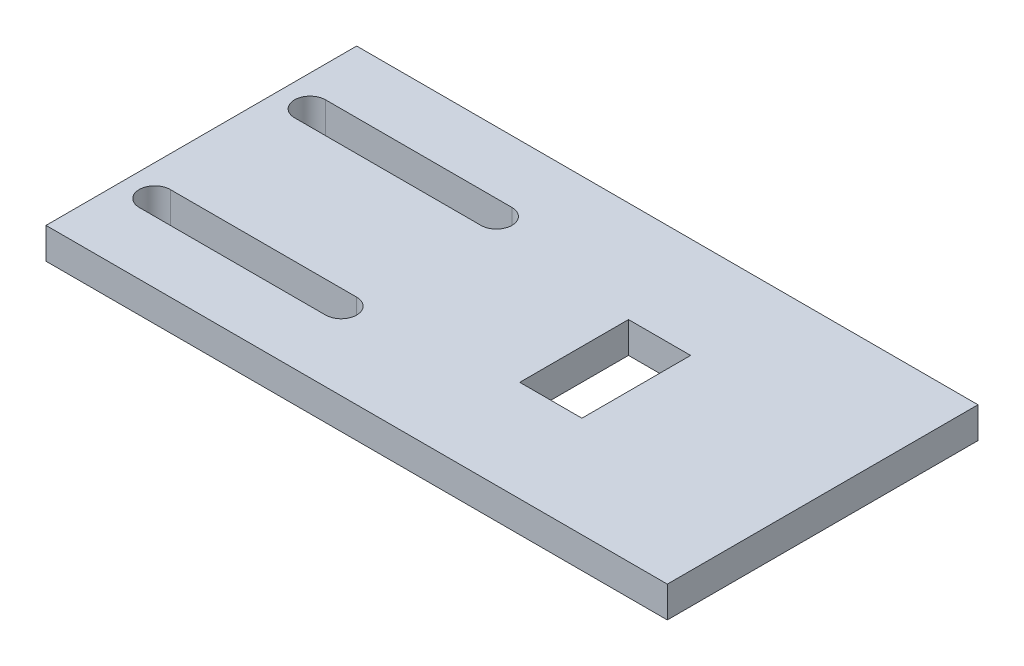
ISO-10303-21;
HEADER;
FILE_DESCRIPTION(('STEP AP214'),'2;1');
FILE_NAME('part.step','',(''),(''),'','','');
FILE_SCHEMA(('AUTOMOTIVE_DESIGN { 1 0 10303 214 1 1 1 1 }'));
ENDSEC;
DATA;
#1=APPLICATION_CONTEXT('core data for automotive mechanical design processes');
#2=APPLICATION_PROTOCOL_DEFINITION('international standard','automotive_design',2000,#1);
#3=PRODUCT_CONTEXT('',#1,'mechanical');
#4=PRODUCT('Part','Part','',(#3));
#5=PRODUCT_RELATED_PRODUCT_CATEGORY('part','',(#4));
#6=PRODUCT_DEFINITION_FORMATION('','',#4);
#7=PRODUCT_DEFINITION_CONTEXT('part definition',#1,'design');
#8=PRODUCT_DEFINITION('design','',#6,#7);
#9=PRODUCT_DEFINITION_SHAPE('','',#8);
#10=(LENGTH_UNIT() NAMED_UNIT(*) SI_UNIT(.MILLI.,.METRE.));
#11=(NAMED_UNIT(*) PLANE_ANGLE_UNIT() SI_UNIT($,.RADIAN.));
#12=(NAMED_UNIT(*) SI_UNIT($,.STERADIAN.) SOLID_ANGLE_UNIT());
#13=UNCERTAINTY_MEASURE_WITH_UNIT(LENGTH_MEASURE(1.E-05),#10,'distance_accuracy_value','');
#14=(GEOMETRIC_REPRESENTATION_CONTEXT(3) GLOBAL_UNCERTAINTY_ASSIGNED_CONTEXT((#13)) GLOBAL_UNIT_ASSIGNED_CONTEXT((#10,
#11,#12)) REPRESENTATION_CONTEXT('',''));
#15=CARTESIAN_POINT('',(0.,0.,0.));
#16=DIRECTION('',(0.,0.,1.));
#17=DIRECTION('',(1.,0.,0.));
#18=AXIS2_PLACEMENT_3D('',#15,#16,#17);
#19=CARTESIAN_POINT('',(50.,5.,-25.));
#20=DIRECTION('',(-1.,0.,0.));
#21=DIRECTION('',(0.,0.,1.));
#22=AXIS2_PLACEMENT_3D('',#19,#20,#21);
#23=PLANE('',#22);
#24=DIRECTION('',(0.,0.,-1.));
#25=VECTOR('',#24,1.);
#26=CARTESIAN_POINT('',(50.,0.,-25.));
#27=LINE('',#26,#25);
#28=CARTESIAN_POINT('',(50.,0.,25.));
#29=VERTEX_POINT('',#28);
#30=CARTESIAN_POINT('',(50.,0.,-25.));
#31=VERTEX_POINT('',#30);
#32=EDGE_CURVE('E243',#29,#31,#27,.T.);
#33=ORIENTED_EDGE('',*,*,#32,.T.);
#34=DIRECTION('',(0.,-1.,0.));
#35=VECTOR('',#34,1.);
#36=CARTESIAN_POINT('',(50.,5.,-25.));
#37=LINE('',#36,#35);
#38=CARTESIAN_POINT('',(50.,5.,-25.));
#39=VERTEX_POINT('',#38);
#40=EDGE_CURVE('E290',#39,#31,#37,.T.);
#41=ORIENTED_EDGE('',*,*,#40,.F.);
#42=DIRECTION('',(0.,0.,-1.));
#43=VECTOR('',#42,1.);
#44=CARTESIAN_POINT('',(50.,5.,-25.));
#45=LINE('',#44,#43);
#46=CARTESIAN_POINT('',(50.,5.,25.));
#47=VERTEX_POINT('',#46);
#48=EDGE_CURVE('E253',#47,#39,#45,.T.);
#49=ORIENTED_EDGE('',*,*,#48,.F.);
#50=DIRECTION('',(0.,-1.,0.));
#51=VECTOR('',#50,1.);
#52=CARTESIAN_POINT('',(50.,5.,25.));
#53=LINE('',#52,#51);
#54=EDGE_CURVE('E267',#47,#29,#53,.T.);
#55=ORIENTED_EDGE('',*,*,#54,.T.);
#56=EDGE_LOOP('',(#33,#41,#49,#55));
#57=FACE_BOUND('',#56,.T.);
#58=ADVANCED_FACE('F45',(#57),#23,.F.);
#59=CARTESIAN_POINT('',(-50.,5.,-25.));
#60=DIRECTION('',(0.,0.,1.));
#61=DIRECTION('',(1.,0.,0.));
#62=AXIS2_PLACEMENT_3D('',#59,#60,#61);
#63=PLANE('',#62);
#64=DIRECTION('',(-1.,0.,0.));
#65=VECTOR('',#64,1.);
#66=CARTESIAN_POINT('',(-50.,0.,-25.));
#67=LINE('',#66,#65);
#68=CARTESIAN_POINT('',(-50.,0.,-25.));
#69=VERTEX_POINT('',#68);
#70=EDGE_CURVE('E271',#31,#69,#67,.T.);
#71=ORIENTED_EDGE('',*,*,#70,.T.);
#72=DIRECTION('',(0.,-1.,0.));
#73=VECTOR('',#72,1.);
#74=CARTESIAN_POINT('',(-50.,5.,-25.));
#75=LINE('',#74,#73);
#76=CARTESIAN_POINT('',(-50.,5.,-25.));
#77=VERTEX_POINT('',#76);
#78=EDGE_CURVE('E286',#77,#69,#75,.T.);
#79=ORIENTED_EDGE('',*,*,#78,.F.);
#80=DIRECTION('',(-1.,0.,0.));
#81=VECTOR('',#80,1.);
#82=CARTESIAN_POINT('',(-50.,5.,-25.));
#83=LINE('',#82,#81);
#84=EDGE_CURVE('E257',#39,#77,#83,.T.);
#85=ORIENTED_EDGE('',*,*,#84,.F.);
#86=ORIENTED_EDGE('',*,*,#40,.T.);
#87=EDGE_LOOP('',(#71,#79,#85,#86));
#88=FACE_BOUND('',#87,.T.);
#89=ADVANCED_FACE('F353',(#88),#63,.F.);
#90=CARTESIAN_POINT('',(-50.,5.,-25.));
#91=DIRECTION('',(1.,0.,0.));
#92=DIRECTION('',(0.,0.,-1.));
#93=AXIS2_PLACEMENT_3D('',#90,#91,#92);
#94=PLANE('',#93);
#95=DIRECTION('',(0.,0.,1.));
#96=VECTOR('',#95,1.);
#97=CARTESIAN_POINT('',(-50.,0.,-25.));
#98=LINE('',#97,#96);
#99=CARTESIAN_POINT('',(-50.,0.,25.));
#100=VERTEX_POINT('',#99);
#101=EDGE_CURVE('E274',#69,#100,#98,.T.);
#102=ORIENTED_EDGE('',*,*,#101,.T.);
#103=DIRECTION('',(0.,-1.,0.));
#104=VECTOR('',#103,1.);
#105=CARTESIAN_POINT('',(-50.,5.,25.));
#106=LINE('',#105,#104);
#107=CARTESIAN_POINT('',(-50.,5.,25.));
#108=VERTEX_POINT('',#107);
#109=EDGE_CURVE('E282',#108,#100,#106,.T.);
#110=ORIENTED_EDGE('',*,*,#109,.F.);
#111=DIRECTION('',(0.,0.,1.));
#112=VECTOR('',#111,1.);
#113=CARTESIAN_POINT('',(-50.,5.,-25.));
#114=LINE('',#113,#112);
#115=EDGE_CURVE('E261',#77,#108,#114,.T.);
#116=ORIENTED_EDGE('',*,*,#115,.F.);
#117=ORIENTED_EDGE('',*,*,#78,.T.);
#118=EDGE_LOOP('',(#102,#110,#116,#117));
#119=FACE_BOUND('',#118,.T.);
#120=ADVANCED_FACE('F358',(#119),#94,.F.);
#121=CARTESIAN_POINT('',(-50.,5.,25.));
#122=DIRECTION('',(0.,0.,-1.));
#123=DIRECTION('',(-1.,0.,0.));
#124=AXIS2_PLACEMENT_3D('',#121,#122,#123);
#125=PLANE('',#124);
#126=DIRECTION('',(1.,0.,0.));
#127=VECTOR('',#126,1.);
#128=CARTESIAN_POINT('',(-50.,0.,25.));
#129=LINE('',#128,#127);
#130=EDGE_CURVE('E258',#100,#29,#129,.T.);
#131=ORIENTED_EDGE('',*,*,#130,.T.);
#132=ORIENTED_EDGE('',*,*,#54,.F.);
#133=DIRECTION('',(1.,0.,0.));
#134=VECTOR('',#133,1.);
#135=CARTESIAN_POINT('',(-50.,5.,25.));
#136=LINE('',#135,#134);
#137=EDGE_CURVE('E264',#108,#47,#136,.T.);
#138=ORIENTED_EDGE('',*,*,#137,.F.);
#139=ORIENTED_EDGE('',*,*,#109,.T.);
#140=EDGE_LOOP('',(#131,#132,#138,#139));
#141=FACE_BOUND('',#140,.T.);
#142=ADVANCED_FACE('F373',(#141),#125,.F.);
#143=CARTESIAN_POINT('',(0.,5.,0.));
#144=DIRECTION('',(0.,1.,0.));
#145=DIRECTION('',(0.,0.,1.));
#146=AXIS2_PLACEMENT_3D('',#143,#144,#145);
#147=PLANE('',#146);
#148=CARTESIAN_POINT('',(-45.,5.,-12.5));
#149=DIRECTION('',(0.,1.,0.));
#150=DIRECTION('',(0.,0.,1.));
#151=AXIS2_PLACEMENT_3D('',#148,#149,#150);
#152=CIRCLE('',#151,2.5);
#153=CARTESIAN_POINT('',(-45.,5.,-15.));
#154=VERTEX_POINT('',#153);
#155=CARTESIAN_POINT('',(-45.,5.,-10.));
#156=VERTEX_POINT('',#155);
#157=EDGE_CURVE('E60',#154,#156,#152,.T.);
#158=ORIENTED_EDGE('',*,*,#157,.F.);
#159=DIRECTION('',(-1.,0.,0.));
#160=VECTOR('',#159,1.);
#161=CARTESIAN_POINT('',(-45.,5.,-15.));
#162=LINE('',#161,#160);
#163=CARTESIAN_POINT('',(-15.,5.,-15.));
#164=VERTEX_POINT('',#163);
#165=EDGE_CURVE('E184',#164,#154,#162,.T.);
#166=ORIENTED_EDGE('',*,*,#165,.F.);
#167=CARTESIAN_POINT('',(-15.,5.,-12.5));
#168=DIRECTION('',(0.,1.,0.));
#169=DIRECTION('',(0.,0.,1.));
#170=AXIS2_PLACEMENT_3D('',#167,#168,#169);
#171=CIRCLE('',#170,2.50000000000001);
#172=CARTESIAN_POINT('',(-15.,5.,-10.));
#173=VERTEX_POINT('',#172);
#174=EDGE_CURVE('E165',#173,#164,#171,.T.);
#175=ORIENTED_EDGE('',*,*,#174,.F.);
#176=DIRECTION('',(1.,0.,0.));
#177=VECTOR('',#176,1.);
#178=CARTESIAN_POINT('',(-45.,5.,-10.));
#179=LINE('',#178,#177);
#180=EDGE_CURVE('E176',#156,#173,#179,.T.);
#181=ORIENTED_EDGE('',*,*,#180,.F.);
#182=EDGE_LOOP('',(#158,#166,#175,#181));
#183=FACE_BOUND('',#182,.T.);
#184=CARTESIAN_POINT('',(-45.,5.,12.5));
#185=DIRECTION('',(0.,1.,0.));
#186=DIRECTION('',(0.,0.,1.));
#187=AXIS2_PLACEMENT_3D('',#184,#185,#186);
#188=CIRCLE('',#187,2.5);
#189=CARTESIAN_POINT('',(-45.,5.,9.99999999999999));
#190=VERTEX_POINT('',#189);
#191=CARTESIAN_POINT('',(-45.,5.,15.));
#192=VERTEX_POINT('',#191);
#193=EDGE_CURVE('E68',#190,#192,#188,.T.);
#194=ORIENTED_EDGE('',*,*,#193,.F.);
#195=DIRECTION('',(-1.,0.,0.));
#196=VECTOR('',#195,1.);
#197=CARTESIAN_POINT('',(-45.,5.,9.99999999999999));
#198=LINE('',#197,#196);
#199=CARTESIAN_POINT('',(-15.,5.,9.99999999999999));
#200=VERTEX_POINT('',#199);
#201=EDGE_CURVE('E202',#200,#190,#198,.T.);
#202=ORIENTED_EDGE('',*,*,#201,.F.);
#203=CARTESIAN_POINT('',(-15.,5.,12.5));
#204=DIRECTION('',(0.,1.,0.));
#205=DIRECTION('',(0.,0.,1.));
#206=AXIS2_PLACEMENT_3D('',#203,#204,#205);
#207=CIRCLE('',#206,2.50000000000001);
#208=CARTESIAN_POINT('',(-15.,5.,15.));
#209=VERTEX_POINT('',#208);
#210=EDGE_CURVE('E215',#209,#200,#207,.T.);
#211=ORIENTED_EDGE('',*,*,#210,.F.);
#212=DIRECTION('',(1.,0.,0.));
#213=VECTOR('',#212,1.);
#214=CARTESIAN_POINT('',(-45.,5.,15.));
#215=LINE('',#214,#213);
#216=EDGE_CURVE('E219',#192,#209,#215,.T.);
#217=ORIENTED_EDGE('',*,*,#216,.F.);
#218=EDGE_LOOP('',(#194,#202,#211,#217));
#219=FACE_BOUND('',#218,.T.);
#220=DIRECTION('',(0.,0.,-1.));
#221=VECTOR('',#220,1.);
#222=CARTESIAN_POINT('',(20.,5.,-8.75));
#223=LINE('',#222,#221);
#224=CARTESIAN_POINT('',(20.,5.,8.75));
#225=VERTEX_POINT('',#224);
#226=CARTESIAN_POINT('',(20.,5.,-8.75));
#227=VERTEX_POINT('',#226);
#228=EDGE_CURVE('E194',#225,#227,#223,.T.);
#229=ORIENTED_EDGE('',*,*,#228,.F.);
#230=DIRECTION('',(1.,0.,0.));
#231=VECTOR('',#230,1.);
#232=CARTESIAN_POINT('',(10.,5.,8.75));
#233=LINE('',#232,#231);
#234=CARTESIAN_POINT('',(10.,5.,8.75));
#235=VERTEX_POINT('',#234);
#236=EDGE_CURVE('E235',#235,#225,#233,.T.);
#237=ORIENTED_EDGE('',*,*,#236,.F.);
#238=DIRECTION('',(0.,0.,1.));
#239=VECTOR('',#238,1.);
#240=CARTESIAN_POINT('',(10.,5.,-8.75));
#241=LINE('',#240,#239);
#242=CARTESIAN_POINT('',(10.,5.,-8.75));
#243=VERTEX_POINT('',#242);
#244=EDGE_CURVE('E231',#243,#235,#241,.T.);
#245=ORIENTED_EDGE('',*,*,#244,.F.);
#246=DIRECTION('',(-1.,0.,0.));
#247=VECTOR('',#246,1.);
#248=CARTESIAN_POINT('',(10.,5.,-8.75));
#249=LINE('',#248,#247);
#250=EDGE_CURVE('E227',#227,#243,#249,.T.);
#251=ORIENTED_EDGE('',*,*,#250,.F.);
#252=EDGE_LOOP('',(#229,#237,#245,#251));
#253=FACE_BOUND('',#252,.T.);
#254=ORIENTED_EDGE('',*,*,#48,.T.);
#255=ORIENTED_EDGE('',*,*,#84,.T.);
#256=ORIENTED_EDGE('',*,*,#115,.T.);
#257=ORIENTED_EDGE('',*,*,#137,.T.);
#258=EDGE_LOOP('',(#254,#255,#256,#257));
#259=FACE_BOUND('',#258,.T.);
#260=ADVANCED_FACE('F181',(#183,#219,#253,#259),#147,.T.);
#261=CARTESIAN_POINT('',(0.,0.,0.));
#262=DIRECTION('',(0.,1.,0.));
#263=DIRECTION('',(0.,0.,1.));
#264=AXIS2_PLACEMENT_3D('',#261,#262,#263);
#265=PLANE('',#264);
#266=DIRECTION('',(-1.,0.,0.));
#267=VECTOR('',#266,1.);
#268=CARTESIAN_POINT('',(0.,0.,-15.));
#269=LINE('',#268,#267);
#270=CARTESIAN_POINT('',(-15.,0.,-15.));
#271=VERTEX_POINT('',#270);
#272=CARTESIAN_POINT('',(-45.,0.,-15.));
#273=VERTEX_POINT('',#272);
#274=EDGE_CURVE('E53',#271,#273,#269,.T.);
#275=ORIENTED_EDGE('',*,*,#274,.T.);
#276=CARTESIAN_POINT('',(-45.,0.,-12.5));
#277=DIRECTION('',(0.,1.,0.));
#278=DIRECTION('',(0.,0.,1.));
#279=AXIS2_PLACEMENT_3D('',#276,#277,#278);
#280=CIRCLE('',#279,2.5);
#281=CARTESIAN_POINT('',(-45.,0.,-10.));
#282=VERTEX_POINT('',#281);
#283=EDGE_CURVE('E11',#273,#282,#280,.T.);
#284=ORIENTED_EDGE('',*,*,#283,.T.);
#285=DIRECTION('',(1.,0.,0.));
#286=VECTOR('',#285,1.);
#287=CARTESIAN_POINT('',(0.,0.,-10.));
#288=LINE('',#287,#286);
#289=CARTESIAN_POINT('',(-15.,0.,-10.));
#290=VERTEX_POINT('',#289);
#291=EDGE_CURVE('E326',#282,#290,#288,.T.);
#292=ORIENTED_EDGE('',*,*,#291,.T.);
#293=CARTESIAN_POINT('',(-15.,0.,-12.5));
#294=DIRECTION('',(0.,1.,0.));
#295=DIRECTION('',(0.,0.,1.));
#296=AXIS2_PLACEMENT_3D('',#293,#294,#295);
#297=CIRCLE('',#296,2.50000000000001);
#298=EDGE_CURVE('E168',#290,#271,#297,.T.);
#299=ORIENTED_EDGE('',*,*,#298,.T.);
#300=EDGE_LOOP('',(#275,#284,#292,#299));
#301=FACE_BOUND('',#300,.T.);
#302=DIRECTION('',(-1.,0.,0.));
#303=VECTOR('',#302,1.);
#304=CARTESIAN_POINT('',(0.,0.,9.99999999999998));
#305=LINE('',#304,#303);
#306=CARTESIAN_POINT('',(-15.,0.,9.99999999999999));
#307=VERTEX_POINT('',#306);
#308=CARTESIAN_POINT('',(-45.,0.,9.99999999999999));
#309=VERTEX_POINT('',#308);
#310=EDGE_CURVE('E318',#307,#309,#305,.T.);
#311=ORIENTED_EDGE('',*,*,#310,.T.);
#312=CARTESIAN_POINT('',(-45.,0.,12.5));
#313=DIRECTION('',(0.,1.,0.));
#314=DIRECTION('',(0.,0.,1.));
#315=AXIS2_PLACEMENT_3D('',#312,#313,#314);
#316=CIRCLE('',#315,2.5);
#317=CARTESIAN_POINT('',(-45.,0.,15.));
#318=VERTEX_POINT('',#317);
#319=EDGE_CURVE('E322',#309,#318,#316,.T.);
#320=ORIENTED_EDGE('',*,*,#319,.T.);
#321=DIRECTION('',(1.,0.,0.));
#322=VECTOR('',#321,1.);
#323=CARTESIAN_POINT('',(0.,0.,15.));
#324=LINE('',#323,#322);
#325=CARTESIAN_POINT('',(-15.,0.,15.));
#326=VERTEX_POINT('',#325);
#327=EDGE_CURVE('E310',#318,#326,#324,.T.);
#328=ORIENTED_EDGE('',*,*,#327,.T.);
#329=CARTESIAN_POINT('',(-15.,0.,12.5));
#330=DIRECTION('',(0.,1.,0.));
#331=DIRECTION('',(0.,0.,1.));
#332=AXIS2_PLACEMENT_3D('',#329,#330,#331);
#333=CIRCLE('',#332,2.50000000000001);
#334=EDGE_CURVE('E314',#326,#307,#333,.T.);
#335=ORIENTED_EDGE('',*,*,#334,.T.);
#336=EDGE_LOOP('',(#311,#320,#328,#335));
#337=FACE_BOUND('',#336,.T.);
#338=DIRECTION('',(1.,0.,0.));
#339=VECTOR('',#338,1.);
#340=CARTESIAN_POINT('',(0.,0.,8.75));
#341=LINE('',#340,#339);
#342=CARTESIAN_POINT('',(10.,0.,8.75));
#343=VERTEX_POINT('',#342);
#344=CARTESIAN_POINT('',(20.,0.,8.75));
#345=VERTEX_POINT('',#344);
#346=EDGE_CURVE('E302',#343,#345,#341,.T.);
#347=ORIENTED_EDGE('',*,*,#346,.T.);
#348=DIRECTION('',(0.,0.,-1.));
#349=VECTOR('',#348,1.);
#350=CARTESIAN_POINT('',(20.,0.,0.));
#351=LINE('',#350,#349);
#352=CARTESIAN_POINT('',(20.,0.,-8.75));
#353=VERTEX_POINT('',#352);
#354=EDGE_CURVE('E306',#345,#353,#351,.T.);
#355=ORIENTED_EDGE('',*,*,#354,.T.);
#356=DIRECTION('',(-1.,0.,0.));
#357=VECTOR('',#356,1.);
#358=CARTESIAN_POINT('',(0.,0.,-8.75));
#359=LINE('',#358,#357);
#360=CARTESIAN_POINT('',(10.,0.,-8.75));
#361=VERTEX_POINT('',#360);
#362=EDGE_CURVE('E294',#353,#361,#359,.T.);
#363=ORIENTED_EDGE('',*,*,#362,.T.);
#364=DIRECTION('',(0.,0.,1.));
#365=VECTOR('',#364,1.);
#366=CARTESIAN_POINT('',(10.,0.,0.));
#367=LINE('',#366,#365);
#368=EDGE_CURVE('E298',#361,#343,#367,.T.);
#369=ORIENTED_EDGE('',*,*,#368,.T.);
#370=EDGE_LOOP('',(#347,#355,#363,#369));
#371=FACE_BOUND('',#370,.T.);
#372=ORIENTED_EDGE('',*,*,#32,.F.);
#373=ORIENTED_EDGE('',*,*,#130,.F.);
#374=ORIENTED_EDGE('',*,*,#101,.F.);
#375=ORIENTED_EDGE('',*,*,#70,.F.);
#376=EDGE_LOOP('',(#372,#373,#374,#375));
#377=FACE_BOUND('',#376,.T.);
#378=ADVANCED_FACE('F333',(#301,#337,#371,#377),#265,.F.);
#379=CARTESIAN_POINT('',(20.,-2.5,-8.75));
#380=DIRECTION('',(1.,0.,0.));
#381=DIRECTION('',(0.,0.,-1.));
#382=AXIS2_PLACEMENT_3D('',#379,#380,#381);
#383=PLANE('',#382);
#384=DIRECTION('',(0.,1.,0.));
#385=VECTOR('',#384,1.);
#386=CARTESIAN_POINT('',(20.,-2.5,8.75));
#387=LINE('',#386,#385);
#388=EDGE_CURVE('E240',#345,#225,#387,.T.);
#389=ORIENTED_EDGE('',*,*,#388,.T.);
#390=ORIENTED_EDGE('',*,*,#228,.T.);
#391=DIRECTION('',(0.,1.,0.));
#392=VECTOR('',#391,1.);
#393=CARTESIAN_POINT('',(20.,-2.5,-8.75));
#394=LINE('',#393,#392);
#395=EDGE_CURVE('E239',#353,#227,#394,.T.);
#396=ORIENTED_EDGE('',*,*,#395,.F.);
#397=ORIENTED_EDGE('',*,*,#354,.F.);
#398=EDGE_LOOP('',(#389,#390,#396,#397));
#399=FACE_BOUND('',#398,.T.);
#400=ADVANCED_FACE('F384',(#399),#383,.F.);
#401=CARTESIAN_POINT('',(10.,-2.5,8.75));
#402=DIRECTION('',(0.,0.,1.));
#403=DIRECTION('',(1.,0.,0.));
#404=AXIS2_PLACEMENT_3D('',#401,#402,#403);
#405=PLANE('',#404);
#406=DIRECTION('',(0.,1.,0.));
#407=VECTOR('',#406,1.);
#408=CARTESIAN_POINT('',(10.,-2.5,8.75));
#409=LINE('',#408,#407);
#410=EDGE_CURVE('E244',#343,#235,#409,.T.);
#411=ORIENTED_EDGE('',*,*,#410,.T.);
#412=ORIENTED_EDGE('',*,*,#236,.T.);
#413=ORIENTED_EDGE('',*,*,#388,.F.);
#414=ORIENTED_EDGE('',*,*,#346,.F.);
#415=EDGE_LOOP('',(#411,#412,#413,#414));
#416=FACE_BOUND('',#415,.T.);
#417=ADVANCED_FACE('F389',(#416),#405,.F.);
#418=CARTESIAN_POINT('',(10.,-2.5,-8.75));
#419=DIRECTION('',(-1.,0.,0.));
#420=DIRECTION('',(0.,0.,1.));
#421=AXIS2_PLACEMENT_3D('',#418,#419,#420);
#422=PLANE('',#421);
#423=DIRECTION('',(0.,1.,0.));
#424=VECTOR('',#423,1.);
#425=CARTESIAN_POINT('',(10.,-2.5,-8.75));
#426=LINE('',#425,#424);
#427=EDGE_CURVE('E247',#361,#243,#426,.T.);
#428=ORIENTED_EDGE('',*,*,#427,.T.);
#429=ORIENTED_EDGE('',*,*,#244,.T.);
#430=ORIENTED_EDGE('',*,*,#410,.F.);
#431=ORIENTED_EDGE('',*,*,#368,.F.);
#432=EDGE_LOOP('',(#428,#429,#430,#431));
#433=FACE_BOUND('',#432,.T.);
#434=ADVANCED_FACE('F395',(#433),#422,.F.);
#435=CARTESIAN_POINT('',(10.,-2.5,-8.75));
#436=DIRECTION('',(0.,0.,-1.));
#437=DIRECTION('',(-1.,0.,0.));
#438=AXIS2_PLACEMENT_3D('',#435,#436,#437);
#439=PLANE('',#438);
#440=ORIENTED_EDGE('',*,*,#395,.T.);
#441=ORIENTED_EDGE('',*,*,#250,.T.);
#442=ORIENTED_EDGE('',*,*,#427,.F.);
#443=ORIENTED_EDGE('',*,*,#362,.F.);
#444=EDGE_LOOP('',(#440,#441,#442,#443));
#445=FACE_BOUND('',#444,.T.);
#446=ADVANCED_FACE('F391',(#445),#439,.F.);
#447=CARTESIAN_POINT('',(-45.,-2.5,12.5));
#448=DIRECTION('',(0.,1.,0.));
#449=DIRECTION('',(0.,0.,1.));
#450=AXIS2_PLACEMENT_3D('',#447,#448,#449);
#451=CYLINDRICAL_SURFACE('',#450,2.5);
#452=DIRECTION('',(0.,1.,0.));
#453=VECTOR('',#452,1.);
#454=CARTESIAN_POINT('',(-45.,-2.5,9.99999999999999));
#455=LINE('',#454,#453);
#456=EDGE_CURVE('E209',#309,#190,#455,.T.);
#457=ORIENTED_EDGE('',*,*,#456,.T.);
#458=ORIENTED_EDGE('',*,*,#193,.T.);
#459=DIRECTION('',(0.,1.,0.));
#460=VECTOR('',#459,1.);
#461=CARTESIAN_POINT('',(-45.,-2.5,15.));
#462=LINE('',#461,#460);
#463=EDGE_CURVE('E199',#318,#192,#462,.T.);
#464=ORIENTED_EDGE('',*,*,#463,.F.);
#465=ORIENTED_EDGE('',*,*,#319,.F.);
#466=EDGE_LOOP('',(#457,#458,#464,#465));
#467=FACE_BOUND('',#466,.T.);
#468=ADVANCED_FACE('F394',(#467),#451,.F.);
#469=CARTESIAN_POINT('',(-45.,-2.5,9.99999999999999));
#470=DIRECTION('',(0.,0.,-1.));
#471=DIRECTION('',(-1.,0.,0.));
#472=AXIS2_PLACEMENT_3D('',#469,#470,#471);
#473=PLANE('',#472);
#474=DIRECTION('',(0.,1.,0.));
#475=VECTOR('',#474,1.);
#476=CARTESIAN_POINT('',(-15.,-2.5,9.99999999999999));
#477=LINE('',#476,#475);
#478=EDGE_CURVE('E206',#307,#200,#477,.T.);
#479=ORIENTED_EDGE('',*,*,#478,.T.);
#480=ORIENTED_EDGE('',*,*,#201,.T.);
#481=ORIENTED_EDGE('',*,*,#456,.F.);
#482=ORIENTED_EDGE('',*,*,#310,.F.);
#483=EDGE_LOOP('',(#479,#480,#481,#482));
#484=FACE_BOUND('',#483,.T.);
#485=ADVANCED_FACE('F403',(#484),#473,.F.);
#486=CARTESIAN_POINT('',(-15.,-2.5,12.5));
#487=DIRECTION('',(0.,1.,0.));
#488=DIRECTION('',(0.,0.,1.));
#489=AXIS2_PLACEMENT_3D('',#486,#487,#488);
#490=CYLINDRICAL_SURFACE('',#489,2.50000000000001);
#491=DIRECTION('',(0.,1.,0.));
#492=VECTOR('',#491,1.);
#493=CARTESIAN_POINT('',(-15.,-2.5,15.));
#494=LINE('',#493,#492);
#495=EDGE_CURVE('E203',#326,#209,#494,.T.);
#496=ORIENTED_EDGE('',*,*,#495,.T.);
#497=ORIENTED_EDGE('',*,*,#210,.T.);
#498=ORIENTED_EDGE('',*,*,#478,.F.);
#499=ORIENTED_EDGE('',*,*,#334,.F.);
#500=EDGE_LOOP('',(#496,#497,#498,#499));
#501=FACE_BOUND('',#500,.T.);
#502=ADVANCED_FACE('F347',(#501),#490,.F.);
#503=CARTESIAN_POINT('',(-45.,-2.5,15.));
#504=DIRECTION('',(0.,0.,1.));
#505=DIRECTION('',(1.,0.,0.));
#506=AXIS2_PLACEMENT_3D('',#503,#504,#505);
#507=PLANE('',#506);
#508=ORIENTED_EDGE('',*,*,#463,.T.);
#509=ORIENTED_EDGE('',*,*,#216,.T.);
#510=ORIENTED_EDGE('',*,*,#495,.F.);
#511=ORIENTED_EDGE('',*,*,#327,.F.);
#512=EDGE_LOOP('',(#508,#509,#510,#511));
#513=FACE_BOUND('',#512,.T.);
#514=ADVANCED_FACE('F340',(#513),#507,.F.);
#515=CARTESIAN_POINT('',(-45.,-2.5,-12.5));
#516=DIRECTION('',(0.,1.,0.));
#517=DIRECTION('',(0.,0.,1.));
#518=AXIS2_PLACEMENT_3D('',#515,#516,#517);
#519=CYLINDRICAL_SURFACE('',#518,2.5);
#520=DIRECTION('',(0.,1.,0.));
#521=VECTOR('',#520,1.);
#522=CARTESIAN_POINT('',(-45.,-2.5,-15.));
#523=LINE('',#522,#521);
#524=EDGE_CURVE('E191',#273,#154,#523,.T.);
#525=ORIENTED_EDGE('',*,*,#524,.T.);
#526=ORIENTED_EDGE('',*,*,#157,.T.);
#527=DIRECTION('',(0.,1.,0.));
#528=VECTOR('',#527,1.);
#529=CARTESIAN_POINT('',(-45.,-2.5,-10.));
#530=LINE('',#529,#528);
#531=EDGE_CURVE('E173',#282,#156,#530,.T.);
#532=ORIENTED_EDGE('',*,*,#531,.F.);
#533=ORIENTED_EDGE('',*,*,#283,.F.);
#534=EDGE_LOOP('',(#525,#526,#532,#533));
#535=FACE_BOUND('',#534,.T.);
#536=ADVANCED_FACE('F338',(#535),#519,.F.);
#537=CARTESIAN_POINT('',(-45.,-2.5,-15.));
#538=DIRECTION('',(0.,0.,-1.));
#539=DIRECTION('',(-1.,0.,0.));
#540=AXIS2_PLACEMENT_3D('',#537,#538,#539);
#541=PLANE('',#540);
#542=DIRECTION('',(0.,1.,0.));
#543=VECTOR('',#542,1.);
#544=CARTESIAN_POINT('',(-15.,-2.5,-15.));
#545=LINE('',#544,#543);
#546=EDGE_CURVE('E172',#271,#164,#545,.T.);
#547=ORIENTED_EDGE('',*,*,#546,.T.);
#548=ORIENTED_EDGE('',*,*,#165,.T.);
#549=ORIENTED_EDGE('',*,*,#524,.F.);
#550=ORIENTED_EDGE('',*,*,#274,.F.);
#551=EDGE_LOOP('',(#547,#548,#549,#550));
#552=FACE_BOUND('',#551,.T.);
#553=ADVANCED_FACE('F337',(#552),#541,.F.);
#554=CARTESIAN_POINT('',(-15.,-2.5,-12.5));
#555=DIRECTION('',(0.,1.,0.));
#556=DIRECTION('',(0.,0.,1.));
#557=AXIS2_PLACEMENT_3D('',#554,#555,#556);
#558=CYLINDRICAL_SURFACE('',#557,2.50000000000001);
#559=DIRECTION('',(0.,1.,0.));
#560=VECTOR('',#559,1.);
#561=CARTESIAN_POINT('',(-15.,-2.5,-10.));
#562=LINE('',#561,#560);
#563=EDGE_CURVE('E160',#290,#173,#562,.T.);
#564=ORIENTED_EDGE('',*,*,#563,.T.);
#565=ORIENTED_EDGE('',*,*,#174,.T.);
#566=ORIENTED_EDGE('',*,*,#546,.F.);
#567=ORIENTED_EDGE('',*,*,#298,.F.);
#568=EDGE_LOOP('',(#564,#565,#566,#567));
#569=FACE_BOUND('',#568,.T.);
#570=ADVANCED_FACE('F162',(#569),#558,.F.);
#571=CARTESIAN_POINT('',(-45.,-2.5,-10.));
#572=DIRECTION('',(0.,0.,1.));
#573=DIRECTION('',(1.,0.,0.));
#574=AXIS2_PLACEMENT_3D('',#571,#572,#573);
#575=PLANE('',#574);
#576=ORIENTED_EDGE('',*,*,#531,.T.);
#577=ORIENTED_EDGE('',*,*,#180,.T.);
#578=ORIENTED_EDGE('',*,*,#563,.F.);
#579=ORIENTED_EDGE('',*,*,#291,.F.);
#580=EDGE_LOOP('',(#576,#577,#578,#579));
#581=FACE_BOUND('',#580,.T.);
#582=ADVANCED_FACE('F177',(#581),#575,.F.);
#583=CLOSED_SHELL('',(#58,#89,#120,#142,#260,#378,#400,#417,#434,#446,#468,#485,#502,#514,#536,
#553,#570,#582));
#584=MANIFOLD_SOLID_BREP('B2',#583);
#585=ADVANCED_BREP_SHAPE_REPRESENTATION('',(#18,#584),#14);
#586=SHAPE_DEFINITION_REPRESENTATION(#9,#585);
ENDSEC;
END-ISO-10303-21;
